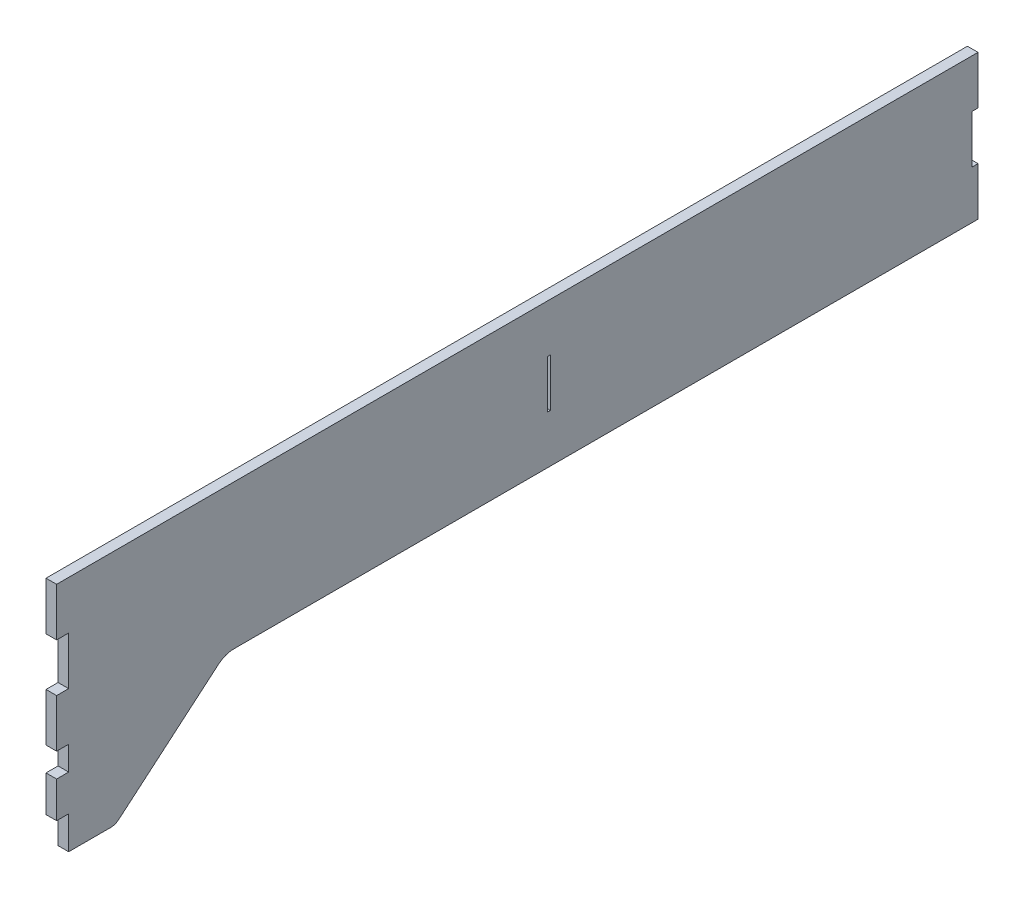
ISO-10303-21;
HEADER;
FILE_DESCRIPTION(('STEP AP214'),'2;1');
FILE_NAME('part.step','',(''),(''),'','','');
FILE_SCHEMA(('AUTOMOTIVE_DESIGN { 1 0 10303 214 1 1 1 1 }'));
ENDSEC;
DATA;
#1=APPLICATION_CONTEXT('core data for automotive mechanical design processes');
#2=APPLICATION_PROTOCOL_DEFINITION('international standard','automotive_design',2000,#1);
#3=PRODUCT_CONTEXT('',#1,'mechanical');
#4=PRODUCT('Part','Part','',(#3));
#5=PRODUCT_RELATED_PRODUCT_CATEGORY('part','',(#4));
#6=PRODUCT_DEFINITION_FORMATION('','',#4);
#7=PRODUCT_DEFINITION_CONTEXT('part definition',#1,'design');
#8=PRODUCT_DEFINITION('design','',#6,#7);
#9=PRODUCT_DEFINITION_SHAPE('','',#8);
#10=(LENGTH_UNIT() NAMED_UNIT(*) SI_UNIT(.MILLI.,.METRE.));
#11=(NAMED_UNIT(*) PLANE_ANGLE_UNIT() SI_UNIT($,.RADIAN.));
#12=(NAMED_UNIT(*) SI_UNIT($,.STERADIAN.) SOLID_ANGLE_UNIT());
#13=UNCERTAINTY_MEASURE_WITH_UNIT(LENGTH_MEASURE(1.E-05),#10,'distance_accuracy_value','');
#14=(GEOMETRIC_REPRESENTATION_CONTEXT(3) GLOBAL_UNCERTAINTY_ASSIGNED_CONTEXT((#13)) GLOBAL_UNIT_ASSIGNED_CONTEXT((#10,
#11,#12)) REPRESENTATION_CONTEXT('',''));
#15=CARTESIAN_POINT('',(0.,0.,0.));
#16=DIRECTION('',(0.,0.,1.));
#17=DIRECTION('',(1.,0.,0.));
#18=AXIS2_PLACEMENT_3D('',#15,#16,#17);
#19=CARTESIAN_POINT('',(-88.9,-8.60422844084499E-13,-196.85));
#20=DIRECTION('',(0.,0.,1.));
#21=DIRECTION('',(0.,-1.,0.));
#22=AXIS2_PLACEMENT_3D('',#19,#20,#21);
#23=PLANE('',#22);
#24=DIRECTION('',(0.,1.,0.));
#25=VECTOR('',#24,1.);
#26=CARTESIAN_POINT('',(-94.488,-8.60422844084499E-13,-196.85));
#27=LINE('',#26,#25);
#28=CARTESIAN_POINT('',(-94.488,-136.525,-196.85));
#29=VERTEX_POINT('',#28);
#30=CARTESIAN_POINT('',(-94.488,-111.125,-196.85));
#31=VERTEX_POINT('',#30);
#32=EDGE_CURVE('E385',#29,#31,#27,.T.);
#33=ORIENTED_EDGE('',*,*,#32,.F.);
#34=DIRECTION('',(-1.,0.,0.));
#35=VECTOR('',#34,1.);
#36=CARTESIAN_POINT('',(-88.9,-136.525,-196.85));
#37=LINE('',#36,#35);
#38=CARTESIAN_POINT('',(-88.9,-136.525,-196.85));
#39=VERTEX_POINT('',#38);
#40=EDGE_CURVE('E11',#39,#29,#37,.T.);
#41=ORIENTED_EDGE('',*,*,#40,.F.);
#42=DIRECTION('',(0.,1.,0.));
#43=VECTOR('',#42,1.);
#44=CARTESIAN_POINT('',(-88.9,-8.60422844084499E-13,-196.85));
#45=LINE('',#44,#43);
#46=CARTESIAN_POINT('',(-88.9,-111.125,-196.85));
#47=VERTEX_POINT('',#46);
#48=EDGE_CURVE('E327',#39,#47,#45,.T.);
#49=ORIENTED_EDGE('',*,*,#48,.T.);
#50=DIRECTION('',(-1.,0.,0.));
#51=VECTOR('',#50,1.);
#52=CARTESIAN_POINT('',(-88.9,-111.125,-196.85));
#53=LINE('',#52,#51);
#54=EDGE_CURVE('E276',#47,#31,#53,.T.);
#55=ORIENTED_EDGE('',*,*,#54,.T.);
#56=EDGE_LOOP('',(#33,#41,#49,#55));
#57=FACE_BOUND('',#56,.T.);
#58=ADVANCED_FACE('F35',(#57),#23,.T.);
#59=CARTESIAN_POINT('',(-88.9,-136.525,0.));
#60=DIRECTION('',(0.,-1.,0.));
#61=DIRECTION('',(0.,0.,-1.));
#62=AXIS2_PLACEMENT_3D('',#59,#60,#61);
#63=PLANE('',#62);
#64=DIRECTION('',(0.,0.,1.));
#65=VECTOR('',#64,1.);
#66=CARTESIAN_POINT('',(-94.488,-136.525,0.));
#67=LINE('',#66,#65);
#68=CARTESIAN_POINT('',(-94.488,-136.525,-203.2));
#69=VERTEX_POINT('',#68);
#70=EDGE_CURVE('E338',#69,#29,#67,.T.);
#71=ORIENTED_EDGE('',*,*,#70,.F.);
#72=DIRECTION('',(-1.,0.,0.));
#73=VECTOR('',#72,1.);
#74=CARTESIAN_POINT('',(-88.9,-136.525,-203.2));
#75=LINE('',#74,#73);
#76=CARTESIAN_POINT('',(-88.9,-136.525,-203.2));
#77=VERTEX_POINT('',#76);
#78=EDGE_CURVE('E45',#77,#69,#75,.T.);
#79=ORIENTED_EDGE('',*,*,#78,.F.);
#80=DIRECTION('',(0.,0.,1.));
#81=VECTOR('',#80,1.);
#82=CARTESIAN_POINT('',(-88.9,-136.525,0.));
#83=LINE('',#82,#81);
#84=EDGE_CURVE('E231',#77,#39,#83,.T.);
#85=ORIENTED_EDGE('',*,*,#84,.T.);
#86=ORIENTED_EDGE('',*,*,#40,.T.);
#87=EDGE_LOOP('',(#71,#79,#85,#86));
#88=FACE_BOUND('',#87,.T.);
#89=ADVANCED_FACE('F470',(#88),#63,.T.);
#90=CARTESIAN_POINT('',(-88.9,0.,-203.2));
#91=DIRECTION('',(0.,0.,-1.));
#92=DIRECTION('',(-1.,0.,0.));
#93=AXIS2_PLACEMENT_3D('',#90,#91,#92);
#94=PLANE('',#93);
#95=DIRECTION('',(0.,-1.,0.));
#96=VECTOR('',#95,1.);
#97=CARTESIAN_POINT('',(-94.488,0.,-203.2));
#98=LINE('',#97,#96);
#99=CARTESIAN_POINT('',(-94.488,-149.225,-203.2));
#100=VERTEX_POINT('',#99);
#101=EDGE_CURVE('E234',#69,#100,#98,.T.);
#102=ORIENTED_EDGE('',*,*,#101,.T.);
#103=DIRECTION('',(-1.,0.,0.));
#104=VECTOR('',#103,1.);
#105=CARTESIAN_POINT('',(-88.9,-149.225,-203.2));
#106=LINE('',#105,#104);
#107=CARTESIAN_POINT('',(-88.9,-149.225,-203.2));
#108=VERTEX_POINT('',#107);
#109=EDGE_CURVE('E221',#108,#100,#106,.T.);
#110=ORIENTED_EDGE('',*,*,#109,.F.);
#111=DIRECTION('',(0.,-1.,0.));
#112=VECTOR('',#111,1.);
#113=CARTESIAN_POINT('',(-88.9,0.,-203.2));
#114=LINE('',#113,#112);
#115=EDGE_CURVE('E226',#77,#108,#114,.T.);
#116=ORIENTED_EDGE('',*,*,#115,.F.);
#117=ORIENTED_EDGE('',*,*,#78,.T.);
#118=EDGE_LOOP('',(#102,#110,#116,#117));
#119=FACE_BOUND('',#118,.T.);
#120=ADVANCED_FACE('F233',(#119),#94,.F.);
#121=CARTESIAN_POINT('',(-88.9,-149.225,0.));
#122=DIRECTION('',(0.,-1.,0.));
#123=DIRECTION('',(0.,0.,-1.));
#124=AXIS2_PLACEMENT_3D('',#121,#122,#123);
#125=PLANE('',#124);
#126=DIRECTION('',(0.,0.,1.));
#127=VECTOR('',#126,1.);
#128=CARTESIAN_POINT('',(-94.488,-149.225,0.));
#129=LINE('',#128,#127);
#130=CARTESIAN_POINT('',(-94.488,-149.225,-196.85));
#131=VERTEX_POINT('',#130);
#132=EDGE_CURVE('E345',#100,#131,#129,.T.);
#133=ORIENTED_EDGE('',*,*,#132,.T.);
#134=DIRECTION('',(-1.,0.,0.));
#135=VECTOR('',#134,1.);
#136=CARTESIAN_POINT('',(-88.9,-149.225,-196.85));
#137=LINE('',#136,#135);
#138=CARTESIAN_POINT('',(-88.9,-149.225,-196.85));
#139=VERTEX_POINT('',#138);
#140=EDGE_CURVE('E222',#139,#131,#137,.T.);
#141=ORIENTED_EDGE('',*,*,#140,.F.);
#142=DIRECTION('',(0.,0.,1.));
#143=VECTOR('',#142,1.);
#144=CARTESIAN_POINT('',(-88.9,-149.225,0.));
#145=LINE('',#144,#143);
#146=EDGE_CURVE('E216',#108,#139,#145,.T.);
#147=ORIENTED_EDGE('',*,*,#146,.F.);
#148=ORIENTED_EDGE('',*,*,#109,.T.);
#149=EDGE_LOOP('',(#133,#141,#147,#148));
#150=FACE_BOUND('',#149,.T.);
#151=ADVANCED_FACE('F219',(#150),#125,.F.);
#152=CARTESIAN_POINT('',(-88.9,0.,-196.85));
#153=DIRECTION('',(0.,0.,1.));
#154=DIRECTION('',(1.,0.,0.));
#155=AXIS2_PLACEMENT_3D('',#152,#153,#154);
#156=PLANE('',#155);
#157=DIRECTION('',(0.,1.,0.));
#158=VECTOR('',#157,1.);
#159=CARTESIAN_POINT('',(-94.488,0.,-196.85));
#160=LINE('',#159,#158);
#161=CARTESIAN_POINT('',(-94.488,-168.275,-196.85));
#162=VERTEX_POINT('',#161);
#163=EDGE_CURVE('E711',#162,#131,#160,.T.);
#164=ORIENTED_EDGE('',*,*,#163,.F.);
#165=DIRECTION('',(-1.,0.,0.));
#166=VECTOR('',#165,1.);
#167=CARTESIAN_POINT('',(-88.9,-168.275,-196.85));
#168=LINE('',#167,#166);
#169=CARTESIAN_POINT('',(-88.9,-168.275,-196.85));
#170=VERTEX_POINT('',#169);
#171=EDGE_CURVE('E237',#170,#162,#168,.T.);
#172=ORIENTED_EDGE('',*,*,#171,.F.);
#173=DIRECTION('',(0.,1.,0.));
#174=VECTOR('',#173,1.);
#175=CARTESIAN_POINT('',(-88.9,0.,-196.85));
#176=LINE('',#175,#174);
#177=EDGE_CURVE('E227',#170,#139,#176,.T.);
#178=ORIENTED_EDGE('',*,*,#177,.T.);
#179=ORIENTED_EDGE('',*,*,#140,.T.);
#180=EDGE_LOOP('',(#164,#172,#178,#179));
#181=FACE_BOUND('',#180,.T.);
#182=ADVANCED_FACE('F536',(#181),#156,.T.);
#183=CARTESIAN_POINT('',(-88.9,-168.275,0.));
#184=DIRECTION('',(0.,1.,0.));
#185=DIRECTION('',(0.,0.,1.));
#186=AXIS2_PLACEMENT_3D('',#183,#184,#185);
#187=PLANE('',#186);
#188=DIRECTION('',(0.,0.,-1.));
#189=VECTOR('',#188,1.);
#190=CARTESIAN_POINT('',(-94.488,-168.275,0.));
#191=LINE('',#190,#189);
#192=CARTESIAN_POINT('',(-94.488,-168.275,-203.2));
#193=VERTEX_POINT('',#192);
#194=EDGE_CURVE('E714',#162,#193,#191,.T.);
#195=ORIENTED_EDGE('',*,*,#194,.T.);
#196=DIRECTION('',(-1.,0.,0.));
#197=VECTOR('',#196,1.);
#198=CARTESIAN_POINT('',(-88.9,-168.275,-203.2));
#199=LINE('',#198,#197);
#200=CARTESIAN_POINT('',(-88.9,-168.275,-203.2));
#201=VERTEX_POINT('',#200);
#202=EDGE_CURVE('E241',#201,#193,#199,.T.);
#203=ORIENTED_EDGE('',*,*,#202,.F.);
#204=DIRECTION('',(0.,0.,-1.));
#205=VECTOR('',#204,1.);
#206=CARTESIAN_POINT('',(-88.9,-168.275,0.));
#207=LINE('',#206,#205);
#208=EDGE_CURVE('E400',#170,#201,#207,.T.);
#209=ORIENTED_EDGE('',*,*,#208,.F.);
#210=ORIENTED_EDGE('',*,*,#171,.T.);
#211=EDGE_LOOP('',(#195,#203,#209,#210));
#212=FACE_BOUND('',#211,.T.);
#213=ADVANCED_FACE('F532',(#212),#187,.F.);
#214=CARTESIAN_POINT('',(-88.9,0.,-203.2));
#215=DIRECTION('',(0.,0.,-1.));
#216=DIRECTION('',(-1.,0.,0.));
#217=AXIS2_PLACEMENT_3D('',#214,#215,#216);
#218=PLANE('',#217);
#219=DIRECTION('',(0.,-1.,0.));
#220=VECTOR('',#219,1.);
#221=CARTESIAN_POINT('',(-94.488,0.,-203.2));
#222=LINE('',#221,#220);
#223=CARTESIAN_POINT('',(-94.488,-185.6232,-203.2));
#224=VERTEX_POINT('',#223);
#225=EDGE_CURVE('E718',#193,#224,#222,.T.);
#226=ORIENTED_EDGE('',*,*,#225,.T.);
#227=DIRECTION('',(-1.,0.,0.));
#228=VECTOR('',#227,1.);
#229=CARTESIAN_POINT('',(-88.9,-185.6232,-203.2));
#230=LINE('',#229,#228);
#231=CARTESIAN_POINT('',(-88.9,-185.6232,-203.2));
#232=VERTEX_POINT('',#231);
#233=EDGE_CURVE('E244',#232,#224,#230,.T.);
#234=ORIENTED_EDGE('',*,*,#233,.F.);
#235=DIRECTION('',(0.,-1.,0.));
#236=VECTOR('',#235,1.);
#237=CARTESIAN_POINT('',(-88.9,0.,-203.2));
#238=LINE('',#237,#236);
#239=EDGE_CURVE('E403',#201,#232,#238,.T.);
#240=ORIENTED_EDGE('',*,*,#239,.F.);
#241=ORIENTED_EDGE('',*,*,#202,.T.);
#242=EDGE_LOOP('',(#226,#234,#240,#241));
#243=FACE_BOUND('',#242,.T.);
#244=ADVANCED_FACE('F528',(#243),#218,.F.);
#245=CARTESIAN_POINT('',(-88.9,-185.6232,0.));
#246=DIRECTION('',(0.,1.,0.));
#247=DIRECTION('',(0.,0.,1.));
#248=AXIS2_PLACEMENT_3D('',#245,#246,#247);
#249=PLANE('',#248);
#250=DIRECTION('',(0.,0.,-1.));
#251=VECTOR('',#250,1.);
#252=CARTESIAN_POINT('',(-94.488,-185.6232,0.));
#253=LINE('',#252,#251);
#254=CARTESIAN_POINT('',(-94.488,-185.6232,-225.468256777908));
#255=VERTEX_POINT('',#254);
#256=EDGE_CURVE('E723',#224,#255,#253,.T.);
#257=ORIENTED_EDGE('',*,*,#256,.T.);
#258=DIRECTION('',(-1.,0.,0.));
#259=VECTOR('',#258,1.);
#260=CARTESIAN_POINT('',(-88.9,-185.6232,-225.468256777908));
#261=LINE('',#260,#259);
#262=CARTESIAN_POINT('',(-88.9,-185.6232,-225.468256777908));
#263=VERTEX_POINT('',#262);
#264=EDGE_CURVE('E247',#263,#255,#261,.T.);
#265=ORIENTED_EDGE('',*,*,#264,.F.);
#266=DIRECTION('',(0.,0.,-1.));
#267=VECTOR('',#266,1.);
#268=CARTESIAN_POINT('',(-88.9,-185.6232,0.));
#269=LINE('',#268,#267);
#270=EDGE_CURVE('E406',#232,#263,#269,.T.);
#271=ORIENTED_EDGE('',*,*,#270,.F.);
#272=ORIENTED_EDGE('',*,*,#233,.T.);
#273=EDGE_LOOP('',(#257,#265,#271,#272));
#274=FACE_BOUND('',#273,.T.);
#275=ADVANCED_FACE('F524',(#274),#249,.F.);
#276=CARTESIAN_POINT('',(-88.9,-179.2732,-225.468256777908));
#277=DIRECTION('',(-1.,0.,0.));
#278=DIRECTION('',(0.,0.,1.));
#279=AXIS2_PLACEMENT_3D('',#276,#277,#278);
#280=CYLINDRICAL_SURFACE('',#279,6.35);
#281=CARTESIAN_POINT('',(-94.488,-179.2732,-225.468256777908));
#282=DIRECTION('',(-1.,0.,0.));
#283=DIRECTION('',(0.,0.,1.));
#284=AXIS2_PLACEMENT_3D('',#281,#282,#283);
#285=CIRCLE('',#284,6.35);
#286=CARTESIAN_POINT('',(-94.488,-184.118202659296,-229.572943030403));
#287=VERTEX_POINT('',#286);
#288=EDGE_CURVE('E726',#287,#255,#285,.T.);
#289=ORIENTED_EDGE('',*,*,#288,.F.);
#290=DIRECTION('',(-1.,0.,0.));
#291=VECTOR('',#290,1.);
#292=CARTESIAN_POINT('',(-88.9,-184.118202659296,-229.572943030403));
#293=LINE('',#292,#291);
#294=CARTESIAN_POINT('',(-88.9,-184.118202659296,-229.572943030403));
#295=VERTEX_POINT('',#294);
#296=EDGE_CURVE('E249',#295,#287,#293,.T.);
#297=ORIENTED_EDGE('',*,*,#296,.F.);
#298=CARTESIAN_POINT('',(-88.9,-179.2732,-225.468256777908));
#299=DIRECTION('',(-1.,0.,0.));
#300=DIRECTION('',(0.,0.,1.));
#301=AXIS2_PLACEMENT_3D('',#298,#299,#300);
#302=CIRCLE('',#301,6.35);
#303=EDGE_CURVE('E408',#295,#263,#302,.T.);
#304=ORIENTED_EDGE('',*,*,#303,.T.);
#305=ORIENTED_EDGE('',*,*,#264,.T.);
#306=EDGE_LOOP('',(#289,#297,#304,#305));
#307=FACE_BOUND('',#306,.T.);
#308=ADVANCED_FACE('F521',(#307),#280,.T.);
#309=CARTESIAN_POINT('',(-88.9,-220.4120949489,-186.73312681973));
#310=DIRECTION('',(0.,0.762992544771004,0.646407283857374));
#311=DIRECTION('',(0.,-0.646407283857374,0.762992544771004));
#312=AXIS2_PLACEMENT_3D('',#309,#310,#311);
#313=PLANE('',#312);
#314=DIRECTION('',(0.,0.646407283857374,-0.762992544771004));
#315=VECTOR('',#314,1.);
#316=CARTESIAN_POINT('',(-94.488,-220.4120949489,-186.73312681973));
#317=LINE('',#316,#315);
#318=CARTESIAN_POINT('',(-94.488,-139.534994681408,-282.197126201904));
#319=VERTEX_POINT('',#318);
#320=EDGE_CURVE('E355',#287,#319,#317,.T.);
#321=ORIENTED_EDGE('',*,*,#320,.T.);
#322=DIRECTION('',(-1.,0.,0.));
#323=VECTOR('',#322,1.);
#324=CARTESIAN_POINT('',(-88.9,-139.534994681408,-282.197126201904));
#325=LINE('',#324,#323);
#326=CARTESIAN_POINT('',(-88.9,-139.534994681408,-282.197126201904));
#327=VERTEX_POINT('',#326);
#328=EDGE_CURVE('E251',#327,#319,#325,.T.);
#329=ORIENTED_EDGE('',*,*,#328,.F.);
#330=DIRECTION('',(0.,0.646407283857374,-0.762992544771004));
#331=VECTOR('',#330,1.);
#332=CARTESIAN_POINT('',(-88.9,-220.4120949489,-186.73312681973));
#333=LINE('',#332,#331);
#334=EDGE_CURVE('E295',#295,#327,#333,.T.);
#335=ORIENTED_EDGE('',*,*,#334,.F.);
#336=ORIENTED_EDGE('',*,*,#296,.T.);
#337=EDGE_LOOP('',(#321,#329,#335,#336));
#338=FACE_BOUND('',#337,.T.);
#339=ADVANCED_FACE('F418',(#338),#313,.F.);
#340=CARTESIAN_POINT('',(-88.9,-149.225,-290.406498706893));
#341=DIRECTION('',(-1.,0.,0.));
#342=DIRECTION('',(0.,0.,1.));
#343=AXIS2_PLACEMENT_3D('',#340,#341,#342);
#344=CYLINDRICAL_SURFACE('',#343,12.7);
#345=CARTESIAN_POINT('',(-94.488,-149.225,-290.406498706893));
#346=DIRECTION('',(-1.,0.,0.));
#347=DIRECTION('',(0.,0.,1.));
#348=AXIS2_PLACEMENT_3D('',#345,#346,#347);
#349=CIRCLE('',#348,12.7);
#350=CARTESIAN_POINT('',(-94.488,-136.525,-290.406498706893));
#351=VERTEX_POINT('',#350);
#352=EDGE_CURVE('E350',#319,#351,#349,.T.);
#353=ORIENTED_EDGE('',*,*,#352,.T.);
#354=DIRECTION('',(-1.,0.,0.));
#355=VECTOR('',#354,1.);
#356=CARTESIAN_POINT('',(-88.9,-136.525,-290.406498706893));
#357=LINE('',#356,#355);
#358=CARTESIAN_POINT('',(-88.9,-136.525,-290.406498706893));
#359=VERTEX_POINT('',#358);
#360=EDGE_CURVE('E254',#359,#351,#357,.T.);
#361=ORIENTED_EDGE('',*,*,#360,.F.);
#362=CARTESIAN_POINT('',(-88.9,-149.225,-290.406498706893));
#363=DIRECTION('',(-1.,0.,0.));
#364=DIRECTION('',(0.,0.,1.));
#365=AXIS2_PLACEMENT_3D('',#362,#363,#364);
#366=CIRCLE('',#365,12.7);
#367=EDGE_CURVE('E291',#327,#359,#366,.T.);
#368=ORIENTED_EDGE('',*,*,#367,.F.);
#369=ORIENTED_EDGE('',*,*,#328,.T.);
#370=EDGE_LOOP('',(#353,#361,#368,#369));
#371=FACE_BOUND('',#370,.T.);
#372=ADVANCED_FACE('F421',(#371),#344,.F.);
#373=CARTESIAN_POINT('',(-94.488,-136.525,-682.625));
#374=VERTEX_POINT('',#373);
#375=EDGE_CURVE('E342',#374,#351,#67,.T.);
#376=ORIENTED_EDGE('',*,*,#375,.F.);
#377=DIRECTION('',(-1.,0.,0.));
#378=VECTOR('',#377,1.);
#379=CARTESIAN_POINT('',(-88.9,-136.525,-682.625));
#380=LINE('',#379,#378);
#381=CARTESIAN_POINT('',(-88.9,-136.525,-682.625));
#382=VERTEX_POINT('',#381);
#383=EDGE_CURVE('E256',#382,#374,#380,.T.);
#384=ORIENTED_EDGE('',*,*,#383,.F.);
#385=EDGE_CURVE('E287',#382,#359,#83,.T.);
#386=ORIENTED_EDGE('',*,*,#385,.T.);
#387=ORIENTED_EDGE('',*,*,#360,.T.);
#388=EDGE_LOOP('',(#376,#384,#386,#387));
#389=FACE_BOUND('',#388,.T.);
#390=ADVANCED_FACE('F422',(#389),#63,.T.);
#391=CARTESIAN_POINT('',(-88.9,0.,-682.625));
#392=DIRECTION('',(0.,0.,-1.));
#393=DIRECTION('',(-1.,0.,0.));
#394=AXIS2_PLACEMENT_3D('',#391,#392,#393);
#395=PLANE('',#394);
#396=DIRECTION('',(0.,-1.,0.));
#397=VECTOR('',#396,1.);
#398=CARTESIAN_POINT('',(-94.488,0.,-682.625));
#399=LINE('',#398,#397);
#400=CARTESIAN_POINT('',(-94.488,-111.125,-682.625));
#401=VERTEX_POINT('',#400);
#402=EDGE_CURVE('E351',#401,#374,#399,.T.);
#403=ORIENTED_EDGE('',*,*,#402,.F.);
#404=DIRECTION('',(-1.,0.,0.));
#405=VECTOR('',#404,1.);
#406=CARTESIAN_POINT('',(-88.9,-111.125,-682.625));
#407=LINE('',#406,#405);
#408=CARTESIAN_POINT('',(-88.9,-111.125,-682.625));
#409=VERTEX_POINT('',#408);
#410=EDGE_CURVE('E258',#409,#401,#407,.T.);
#411=ORIENTED_EDGE('',*,*,#410,.F.);
#412=DIRECTION('',(0.,-1.,0.));
#413=VECTOR('',#412,1.);
#414=CARTESIAN_POINT('',(-88.9,0.,-682.625));
#415=LINE('',#414,#413);
#416=EDGE_CURVE('E292',#409,#382,#415,.T.);
#417=ORIENTED_EDGE('',*,*,#416,.T.);
#418=ORIENTED_EDGE('',*,*,#383,.T.);
#419=EDGE_LOOP('',(#403,#411,#417,#418));
#420=FACE_BOUND('',#419,.T.);
#421=ADVANCED_FACE('F514',(#420),#395,.T.);
#422=CARTESIAN_POINT('',(-88.9,-111.125,0.));
#423=DIRECTION('',(0.,1.,0.));
#424=DIRECTION('',(0.,0.,1.));
#425=AXIS2_PLACEMENT_3D('',#422,#423,#424);
#426=PLANE('',#425);
#427=DIRECTION('',(0.,0.,-1.));
#428=VECTOR('',#427,1.);
#429=CARTESIAN_POINT('',(-94.488,-111.125,0.));
#430=LINE('',#429,#428);
#431=CARTESIAN_POINT('',(-94.488,-111.125,-679.45));
#432=VERTEX_POINT('',#431);
#433=EDGE_CURVE('E356',#432,#401,#430,.T.);
#434=ORIENTED_EDGE('',*,*,#433,.F.);
#435=DIRECTION('',(-1.,0.,0.));
#436=VECTOR('',#435,1.);
#437=CARTESIAN_POINT('',(-88.9,-111.125,-679.45));
#438=LINE('',#437,#436);
#439=CARTESIAN_POINT('',(-88.9,-111.125,-679.45));
#440=VERTEX_POINT('',#439);
#441=EDGE_CURVE('E260',#440,#432,#438,.T.);
#442=ORIENTED_EDGE('',*,*,#441,.F.);
#443=DIRECTION('',(0.,0.,-1.));
#444=VECTOR('',#443,1.);
#445=CARTESIAN_POINT('',(-88.9,-111.125,0.));
#446=LINE('',#445,#444);
#447=EDGE_CURVE('E297',#440,#409,#446,.T.);
#448=ORIENTED_EDGE('',*,*,#447,.T.);
#449=ORIENTED_EDGE('',*,*,#410,.T.);
#450=EDGE_LOOP('',(#434,#442,#448,#449));
#451=FACE_BOUND('',#450,.T.);
#452=ADVANCED_FACE('F427',(#451),#426,.T.);
#453=CARTESIAN_POINT('',(-88.9,0.,-679.45));
#454=DIRECTION('',(0.,0.,-1.));
#455=DIRECTION('',(-1.,0.,0.));
#456=AXIS2_PLACEMENT_3D('',#453,#454,#455);
#457=PLANE('',#456);
#458=DIRECTION('',(0.,-1.,0.));
#459=VECTOR('',#458,1.);
#460=CARTESIAN_POINT('',(-94.488,0.,-679.45));
#461=LINE('',#460,#459);
#462=CARTESIAN_POINT('',(-94.488,-85.7250000000001,-679.45));
#463=VERTEX_POINT('',#462);
#464=EDGE_CURVE('E359',#463,#432,#461,.T.);
#465=ORIENTED_EDGE('',*,*,#464,.F.);
#466=DIRECTION('',(-1.,0.,0.));
#467=VECTOR('',#466,1.);
#468=CARTESIAN_POINT('',(-88.9,-85.7250000000001,-679.45));
#469=LINE('',#468,#467);
#470=CARTESIAN_POINT('',(-88.9,-85.7250000000001,-679.45));
#471=VERTEX_POINT('',#470);
#472=EDGE_CURVE('E262',#471,#463,#469,.T.);
#473=ORIENTED_EDGE('',*,*,#472,.F.);
#474=DIRECTION('',(0.,-1.,0.));
#475=VECTOR('',#474,1.);
#476=CARTESIAN_POINT('',(-88.9,0.,-679.45));
#477=LINE('',#476,#475);
#478=EDGE_CURVE('E301',#471,#440,#477,.T.);
#479=ORIENTED_EDGE('',*,*,#478,.T.);
#480=ORIENTED_EDGE('',*,*,#441,.T.);
#481=EDGE_LOOP('',(#465,#473,#479,#480));
#482=FACE_BOUND('',#481,.T.);
#483=ADVANCED_FACE('F430',(#482),#457,.T.);
#484=CARTESIAN_POINT('',(-88.9,-85.7250000000001,0.));
#485=DIRECTION('',(0.,-1.,0.));
#486=DIRECTION('',(0.,0.,-1.));
#487=AXIS2_PLACEMENT_3D('',#484,#485,#486);
#488=PLANE('',#487);
#489=DIRECTION('',(0.,0.,1.));
#490=VECTOR('',#489,1.);
#491=CARTESIAN_POINT('',(-94.488,-85.7250000000001,0.));
#492=LINE('',#491,#490);
#493=CARTESIAN_POINT('',(-94.488,-85.7250000000001,-682.625));
#494=VERTEX_POINT('',#493);
#495=EDGE_CURVE('E364',#494,#463,#492,.T.);
#496=ORIENTED_EDGE('',*,*,#495,.F.);
#497=DIRECTION('',(-1.,0.,0.));
#498=VECTOR('',#497,1.);
#499=CARTESIAN_POINT('',(-88.9,-85.7250000000001,-682.625));
#500=LINE('',#499,#498);
#501=CARTESIAN_POINT('',(-88.9,-85.7250000000001,-682.625));
#502=VERTEX_POINT('',#501);
#503=EDGE_CURVE('E264',#502,#494,#500,.T.);
#504=ORIENTED_EDGE('',*,*,#503,.F.);
#505=DIRECTION('',(0.,0.,1.));
#506=VECTOR('',#505,1.);
#507=CARTESIAN_POINT('',(-88.9,-85.7250000000001,0.));
#508=LINE('',#507,#506);
#509=EDGE_CURVE('E306',#502,#471,#508,.T.);
#510=ORIENTED_EDGE('',*,*,#509,.T.);
#511=ORIENTED_EDGE('',*,*,#472,.T.);
#512=EDGE_LOOP('',(#496,#504,#510,#511));
#513=FACE_BOUND('',#512,.T.);
#514=ADVANCED_FACE('F435',(#513),#488,.T.);
#515=CARTESIAN_POINT('',(-88.9,0.,-682.625));
#516=DIRECTION('',(0.,0.,-1.));
#517=DIRECTION('',(-1.,0.,0.));
#518=AXIS2_PLACEMENT_3D('',#515,#516,#517);
#519=PLANE('',#518);
#520=DIRECTION('',(0.,-1.,0.));
#521=VECTOR('',#520,1.);
#522=CARTESIAN_POINT('',(-94.488,0.,-682.625));
#523=LINE('',#522,#521);
#524=CARTESIAN_POINT('',(-94.488,-60.3250000000001,-682.625));
#525=VERTEX_POINT('',#524);
#526=EDGE_CURVE('E367',#525,#494,#523,.T.);
#527=ORIENTED_EDGE('',*,*,#526,.F.);
#528=DIRECTION('',(-1.,0.,0.));
#529=VECTOR('',#528,1.);
#530=CARTESIAN_POINT('',(-88.9,-60.3250000000001,-682.625));
#531=LINE('',#530,#529);
#532=CARTESIAN_POINT('',(-88.9,-60.3250000000001,-682.625));
#533=VERTEX_POINT('',#532);
#534=EDGE_CURVE('E266',#533,#525,#531,.T.);
#535=ORIENTED_EDGE('',*,*,#534,.F.);
#536=DIRECTION('',(0.,-1.,0.));
#537=VECTOR('',#536,1.);
#538=CARTESIAN_POINT('',(-88.9,0.,-682.625));
#539=LINE('',#538,#537);
#540=EDGE_CURVE('E309',#533,#502,#539,.T.);
#541=ORIENTED_EDGE('',*,*,#540,.T.);
#542=ORIENTED_EDGE('',*,*,#503,.T.);
#543=EDGE_LOOP('',(#527,#535,#541,#542));
#544=FACE_BOUND('',#543,.T.);
#545=ADVANCED_FACE('F438',(#544),#519,.T.);
#546=CARTESIAN_POINT('',(-88.9,-60.325,0.));
#547=DIRECTION('',(0.,1.,0.));
#548=DIRECTION('',(0.,0.,1.));
#549=AXIS2_PLACEMENT_3D('',#546,#547,#548);
#550=PLANE('',#549);
#551=DIRECTION('',(0.,0.,-1.));
#552=VECTOR('',#551,1.);
#553=CARTESIAN_POINT('',(-94.488,-60.325,0.));
#554=LINE('',#553,#552);
#555=CARTESIAN_POINT('',(-94.488,-60.325,-196.85));
#556=VERTEX_POINT('',#555);
#557=EDGE_CURVE('E370',#556,#525,#554,.T.);
#558=ORIENTED_EDGE('',*,*,#557,.F.);
#559=DIRECTION('',(-1.,0.,0.));
#560=VECTOR('',#559,1.);
#561=CARTESIAN_POINT('',(-88.9,-60.325,-196.85));
#562=LINE('',#561,#560);
#563=CARTESIAN_POINT('',(-88.9,-60.325,-196.85));
#564=VERTEX_POINT('',#563);
#565=EDGE_CURVE('E268',#564,#556,#562,.T.);
#566=ORIENTED_EDGE('',*,*,#565,.F.);
#567=DIRECTION('',(0.,0.,-1.));
#568=VECTOR('',#567,1.);
#569=CARTESIAN_POINT('',(-88.9,-60.325,0.));
#570=LINE('',#569,#568);
#571=EDGE_CURVE('E312',#564,#533,#570,.T.);
#572=ORIENTED_EDGE('',*,*,#571,.T.);
#573=ORIENTED_EDGE('',*,*,#534,.T.);
#574=EDGE_LOOP('',(#558,#566,#572,#573));
#575=FACE_BOUND('',#574,.T.);
#576=ADVANCED_FACE('F443',(#575),#550,.T.);
#577=CARTESIAN_POINT('',(-88.9,8.60422844084493E-13,-196.85));
#578=DIRECTION('',(0.,0.,1.));
#579=DIRECTION('',(0.,-1.,0.));
#580=AXIS2_PLACEMENT_3D('',#577,#578,#579);
#581=PLANE('',#580);
#582=DIRECTION('',(0.,1.,0.));
#583=VECTOR('',#582,1.);
#584=CARTESIAN_POINT('',(-94.488,8.60422844084493E-13,-196.85));
#585=LINE('',#584,#583);
#586=CARTESIAN_POINT('',(-94.488,-85.7250000000001,-196.85));
#587=VERTEX_POINT('',#586);
#588=EDGE_CURVE('E373',#587,#556,#585,.T.);
#589=ORIENTED_EDGE('',*,*,#588,.F.);
#590=DIRECTION('',(-1.,0.,0.));
#591=VECTOR('',#590,1.);
#592=CARTESIAN_POINT('',(-88.9,-85.7250000000001,-196.85));
#593=LINE('',#592,#591);
#594=CARTESIAN_POINT('',(-88.9,-85.7250000000001,-196.85));
#595=VERTEX_POINT('',#594);
#596=EDGE_CURVE('E270',#595,#587,#593,.T.);
#597=ORIENTED_EDGE('',*,*,#596,.F.);
#598=DIRECTION('',(0.,1.,0.));
#599=VECTOR('',#598,1.);
#600=CARTESIAN_POINT('',(-88.9,8.60422844084493E-13,-196.85));
#601=LINE('',#600,#599);
#602=EDGE_CURVE('E315',#595,#564,#601,.T.);
#603=ORIENTED_EDGE('',*,*,#602,.T.);
#604=ORIENTED_EDGE('',*,*,#565,.T.);
#605=EDGE_LOOP('',(#589,#597,#603,#604));
#606=FACE_BOUND('',#605,.T.);
#607=ADVANCED_FACE('F446',(#606),#581,.T.);
#608=CARTESIAN_POINT('',(-88.9,-85.7249999999983,7.4940054162198E-13));
#609=DIRECTION('',(0.,-1.,0.));
#610=DIRECTION('',(0.,0.,-1.));
#611=AXIS2_PLACEMENT_3D('',#608,#609,#610);
#612=PLANE('',#611);
#613=DIRECTION('',(0.,0.,1.));
#614=VECTOR('',#613,1.);
#615=CARTESIAN_POINT('',(-94.488,-85.7249999999983,7.4940054162198E-13));
#616=LINE('',#615,#614);
#617=CARTESIAN_POINT('',(-94.488,-85.7250000000001,-203.2));
#618=VERTEX_POINT('',#617);
#619=EDGE_CURVE('E376',#618,#587,#616,.T.);
#620=ORIENTED_EDGE('',*,*,#619,.F.);
#621=DIRECTION('',(-1.,0.,0.));
#622=VECTOR('',#621,1.);
#623=CARTESIAN_POINT('',(-88.9,-85.7250000000001,-203.2));
#624=LINE('',#623,#622);
#625=CARTESIAN_POINT('',(-88.9,-85.7250000000001,-203.2));
#626=VERTEX_POINT('',#625);
#627=EDGE_CURVE('E272',#626,#618,#624,.T.);
#628=ORIENTED_EDGE('',*,*,#627,.F.);
#629=DIRECTION('',(0.,0.,1.));
#630=VECTOR('',#629,1.);
#631=CARTESIAN_POINT('',(-88.9,-85.7249999999983,7.4940054162198E-13));
#632=LINE('',#631,#630);
#633=EDGE_CURVE('E318',#626,#595,#632,.T.);
#634=ORIENTED_EDGE('',*,*,#633,.T.);
#635=ORIENTED_EDGE('',*,*,#596,.T.);
#636=EDGE_LOOP('',(#620,#628,#634,#635));
#637=FACE_BOUND('',#636,.T.);
#638=ADVANCED_FACE('F451',(#637),#612,.T.);
#639=CARTESIAN_POINT('',(-88.9,0.,-203.2));
#640=DIRECTION('',(0.,0.,1.));
#641=DIRECTION('',(1.,0.,0.));
#642=AXIS2_PLACEMENT_3D('',#639,#640,#641);
#643=PLANE('',#642);
#644=DIRECTION('',(0.,1.,0.));
#645=VECTOR('',#644,1.);
#646=CARTESIAN_POINT('',(-94.488,0.,-203.2));
#647=LINE('',#646,#645);
#648=CARTESIAN_POINT('',(-94.488,-111.125,-203.2));
#649=VERTEX_POINT('',#648);
#650=EDGE_CURVE('E379',#649,#618,#647,.T.);
#651=ORIENTED_EDGE('',*,*,#650,.F.);
#652=DIRECTION('',(-1.,0.,0.));
#653=VECTOR('',#652,1.);
#654=CARTESIAN_POINT('',(-88.9,-111.125,-203.2));
#655=LINE('',#654,#653);
#656=CARTESIAN_POINT('',(-88.9,-111.125,-203.2));
#657=VERTEX_POINT('',#656);
#658=EDGE_CURVE('E274',#657,#649,#655,.T.);
#659=ORIENTED_EDGE('',*,*,#658,.F.);
#660=DIRECTION('',(0.,1.,0.));
#661=VECTOR('',#660,1.);
#662=CARTESIAN_POINT('',(-88.9,0.,-203.2));
#663=LINE('',#662,#661);
#664=EDGE_CURVE('E321',#657,#626,#663,.T.);
#665=ORIENTED_EDGE('',*,*,#664,.T.);
#666=ORIENTED_EDGE('',*,*,#627,.T.);
#667=EDGE_LOOP('',(#651,#659,#665,#666));
#668=FACE_BOUND('',#667,.T.);
#669=ADVANCED_FACE('F454',(#668),#643,.T.);
#670=CARTESIAN_POINT('',(-88.9,0.,-455.6125));
#671=DIRECTION('',(0.,0.,-1.));
#672=DIRECTION('',(-1.,0.,0.));
#673=AXIS2_PLACEMENT_3D('',#670,#671,#672);
#674=PLANE('',#673);
#675=DIRECTION('',(0.,-1.,0.));
#676=VECTOR('',#675,1.);
#677=CARTESIAN_POINT('',(-94.488,0.,-455.6125));
#678=LINE('',#677,#676);
#679=CARTESIAN_POINT('',(-94.488,-85.7250000000001,-455.6125));
#680=VERTEX_POINT('',#679);
#681=CARTESIAN_POINT('',(-94.488,-111.125,-455.6125));
#682=VERTEX_POINT('',#681);
#683=EDGE_CURVE('E396',#680,#682,#678,.T.);
#684=ORIENTED_EDGE('',*,*,#683,.F.);
#685=DIRECTION('',(-1.,0.,0.));
#686=VECTOR('',#685,1.);
#687=CARTESIAN_POINT('',(-88.9,-85.7250000000001,-455.6125));
#688=LINE('',#687,#686);
#689=CARTESIAN_POINT('',(-88.9,-85.7250000000001,-455.6125));
#690=VERTEX_POINT('',#689);
#691=EDGE_CURVE('E278',#690,#680,#688,.T.);
#692=ORIENTED_EDGE('',*,*,#691,.F.);
#693=DIRECTION('',(0.,-1.,0.));
#694=VECTOR('',#693,1.);
#695=CARTESIAN_POINT('',(-88.9,0.,-455.6125));
#696=LINE('',#695,#694);
#697=CARTESIAN_POINT('',(-88.9,-111.125,-455.6125));
#698=VERTEX_POINT('',#697);
#699=EDGE_CURVE('E337',#690,#698,#696,.T.);
#700=ORIENTED_EDGE('',*,*,#699,.T.);
#701=DIRECTION('',(-1.,0.,0.));
#702=VECTOR('',#701,1.);
#703=CARTESIAN_POINT('',(-88.9,-111.125,-455.6125));
#704=LINE('',#703,#702);
#705=EDGE_CURVE('E39',#698,#682,#704,.T.);
#706=ORIENTED_EDGE('',*,*,#705,.T.);
#707=EDGE_LOOP('',(#684,#692,#700,#706));
#708=FACE_BOUND('',#707,.T.);
#709=ADVANCED_FACE('F37',(#708),#674,.T.);
#710=CARTESIAN_POINT('',(-88.9,-85.7250000000001,0.));
#711=DIRECTION('',(0.,-1.,0.));
#712=DIRECTION('',(0.,0.,-1.));
#713=AXIS2_PLACEMENT_3D('',#710,#711,#712);
#714=PLANE('',#713);
#715=DIRECTION('',(0.,0.,1.));
#716=VECTOR('',#715,1.);
#717=CARTESIAN_POINT('',(-94.488,-85.7250000000001,0.));
#718=LINE('',#717,#716);
#719=CARTESIAN_POINT('',(-94.488,-85.7250000000001,-457.2));
#720=VERTEX_POINT('',#719);
#721=EDGE_CURVE('E387',#720,#680,#718,.T.);
#722=ORIENTED_EDGE('',*,*,#721,.F.);
#723=DIRECTION('',(-1.,0.,0.));
#724=VECTOR('',#723,1.);
#725=CARTESIAN_POINT('',(-88.9,-85.7250000000001,-457.2));
#726=LINE('',#725,#724);
#727=CARTESIAN_POINT('',(-88.9,-85.7250000000001,-457.2));
#728=VERTEX_POINT('',#727);
#729=EDGE_CURVE('E280',#728,#720,#726,.T.);
#730=ORIENTED_EDGE('',*,*,#729,.F.);
#731=DIRECTION('',(0.,0.,1.));
#732=VECTOR('',#731,1.);
#733=CARTESIAN_POINT('',(-88.9,-85.7250000000001,0.));
#734=LINE('',#733,#732);
#735=EDGE_CURVE('E329',#728,#690,#734,.T.);
#736=ORIENTED_EDGE('',*,*,#735,.T.);
#737=ORIENTED_EDGE('',*,*,#691,.T.);
#738=EDGE_LOOP('',(#722,#730,#736,#737));
#739=FACE_BOUND('',#738,.T.);
#740=ADVANCED_FACE('F478',(#739),#714,.T.);
#741=CARTESIAN_POINT('',(-88.9,0.,-457.2));
#742=DIRECTION('',(0.,0.,1.));
#743=DIRECTION('',(1.,0.,0.));
#744=AXIS2_PLACEMENT_3D('',#741,#742,#743);
#745=PLANE('',#744);
#746=DIRECTION('',(0.,1.,0.));
#747=VECTOR('',#746,1.);
#748=CARTESIAN_POINT('',(-94.488,0.,-457.2));
#749=LINE('',#748,#747);
#750=CARTESIAN_POINT('',(-94.488,-111.125,-457.2));
#751=VERTEX_POINT('',#750);
#752=EDGE_CURVE('E390',#751,#720,#749,.T.);
#753=ORIENTED_EDGE('',*,*,#752,.F.);
#754=DIRECTION('',(-1.,0.,0.));
#755=VECTOR('',#754,1.);
#756=CARTESIAN_POINT('',(-88.9,-111.125,-457.2));
#757=LINE('',#756,#755);
#758=CARTESIAN_POINT('',(-88.9,-111.125,-457.2));
#759=VERTEX_POINT('',#758);
#760=EDGE_CURVE('E281',#759,#751,#757,.T.);
#761=ORIENTED_EDGE('',*,*,#760,.F.);
#762=DIRECTION('',(0.,1.,0.));
#763=VECTOR('',#762,1.);
#764=CARTESIAN_POINT('',(-88.9,0.,-457.2));
#765=LINE('',#764,#763);
#766=EDGE_CURVE('E332',#759,#728,#765,.T.);
#767=ORIENTED_EDGE('',*,*,#766,.T.);
#768=ORIENTED_EDGE('',*,*,#729,.T.);
#769=EDGE_LOOP('',(#753,#761,#767,#768));
#770=FACE_BOUND('',#769,.T.);
#771=ADVANCED_FACE('F481',(#770),#745,.T.);
#772=CARTESIAN_POINT('',(-88.9,-111.125,0.));
#773=DIRECTION('',(0.,1.,0.));
#774=DIRECTION('',(0.,0.,1.));
#775=AXIS2_PLACEMENT_3D('',#772,#773,#774);
#776=PLANE('',#775);
#777=DIRECTION('',(0.,0.,-1.));
#778=VECTOR('',#777,1.);
#779=CARTESIAN_POINT('',(-94.488,-111.125,0.));
#780=LINE('',#779,#778);
#781=EDGE_CURVE('E393',#682,#751,#780,.T.);
#782=ORIENTED_EDGE('',*,*,#781,.F.);
#783=ORIENTED_EDGE('',*,*,#705,.F.);
#784=DIRECTION('',(0.,0.,-1.));
#785=VECTOR('',#784,1.);
#786=CARTESIAN_POINT('',(-88.9,-111.125,0.));
#787=LINE('',#786,#785);
#788=EDGE_CURVE('E335',#698,#759,#787,.T.);
#789=ORIENTED_EDGE('',*,*,#788,.T.);
#790=ORIENTED_EDGE('',*,*,#760,.T.);
#791=EDGE_LOOP('',(#782,#783,#789,#790));
#792=FACE_BOUND('',#791,.T.);
#793=ADVANCED_FACE('F484',(#792),#776,.T.);
#794=CARTESIAN_POINT('',(-88.9,-111.124999999999,4.85722573273509E-13));
#795=DIRECTION('',(0.,1.,0.));
#796=DIRECTION('',(0.,0.,1.));
#797=AXIS2_PLACEMENT_3D('',#794,#795,#796);
#798=PLANE('',#797);
#799=DIRECTION('',(0.,0.,-1.));
#800=VECTOR('',#799,1.);
#801=CARTESIAN_POINT('',(-94.488,-111.124999999999,4.85722573273509E-13));
#802=LINE('',#801,#800);
#803=EDGE_CURVE('E382',#31,#649,#802,.T.);
#804=ORIENTED_EDGE('',*,*,#803,.F.);
#805=ORIENTED_EDGE('',*,*,#54,.F.);
#806=DIRECTION('',(0.,0.,-1.));
#807=VECTOR('',#806,1.);
#808=CARTESIAN_POINT('',(-88.9,-111.124999999999,4.85722573273509E-13));
#809=LINE('',#808,#807);
#810=EDGE_CURVE('E324',#47,#657,#809,.T.);
#811=ORIENTED_EDGE('',*,*,#810,.T.);
#812=ORIENTED_EDGE('',*,*,#658,.T.);
#813=EDGE_LOOP('',(#804,#805,#811,#812));
#814=FACE_BOUND('',#813,.T.);
#815=ADVANCED_FACE('F458',(#814),#798,.T.);
#816=CARTESIAN_POINT('',(-88.9,0.,0.));
#817=DIRECTION('',(-1.,0.,0.));
#818=DIRECTION('',(0.,0.,1.));
#819=AXIS2_PLACEMENT_3D('',#816,#817,#818);
#820=PLANE('',#819);
#821=ORIENTED_EDGE('',*,*,#699,.F.);
#822=ORIENTED_EDGE('',*,*,#735,.F.);
#823=ORIENTED_EDGE('',*,*,#766,.F.);
#824=ORIENTED_EDGE('',*,*,#788,.F.);
#825=EDGE_LOOP('',(#821,#822,#823,#824));
#826=FACE_BOUND('',#825,.T.);
#827=ORIENTED_EDGE('',*,*,#48,.F.);
#828=ORIENTED_EDGE('',*,*,#84,.F.);
#829=ORIENTED_EDGE('',*,*,#115,.T.);
#830=ORIENTED_EDGE('',*,*,#146,.T.);
#831=ORIENTED_EDGE('',*,*,#177,.F.);
#832=ORIENTED_EDGE('',*,*,#208,.T.);
#833=ORIENTED_EDGE('',*,*,#239,.T.);
#834=ORIENTED_EDGE('',*,*,#270,.T.);
#835=ORIENTED_EDGE('',*,*,#303,.F.);
#836=ORIENTED_EDGE('',*,*,#334,.T.);
#837=ORIENTED_EDGE('',*,*,#367,.T.);
#838=ORIENTED_EDGE('',*,*,#385,.F.);
#839=ORIENTED_EDGE('',*,*,#416,.F.);
#840=ORIENTED_EDGE('',*,*,#447,.F.);
#841=ORIENTED_EDGE('',*,*,#478,.F.);
#842=ORIENTED_EDGE('',*,*,#509,.F.);
#843=ORIENTED_EDGE('',*,*,#540,.F.);
#844=ORIENTED_EDGE('',*,*,#571,.F.);
#845=ORIENTED_EDGE('',*,*,#602,.F.);
#846=ORIENTED_EDGE('',*,*,#633,.F.);
#847=ORIENTED_EDGE('',*,*,#664,.F.);
#848=ORIENTED_EDGE('',*,*,#810,.F.);
#849=EDGE_LOOP('',(#827,#828,#829,#830,#831,#832,#833,#834,#835,#836,#837,#838,#839,#840,#841,
#842,#843,#844,#845,#846,#847,#848));
#850=FACE_BOUND('',#849,.T.);
#851=ADVANCED_FACE('F230',(#826,#850),#820,.F.);
#852=CARTESIAN_POINT('',(-94.488,0.,0.));
#853=DIRECTION('',(-1.,0.,0.));
#854=DIRECTION('',(0.,0.,1.));
#855=AXIS2_PLACEMENT_3D('',#852,#853,#854);
#856=PLANE('',#855);
#857=ORIENTED_EDGE('',*,*,#683,.T.);
#858=ORIENTED_EDGE('',*,*,#781,.T.);
#859=ORIENTED_EDGE('',*,*,#752,.T.);
#860=ORIENTED_EDGE('',*,*,#721,.T.);
#861=EDGE_LOOP('',(#857,#858,#859,#860));
#862=FACE_BOUND('',#861,.T.);
#863=ORIENTED_EDGE('',*,*,#32,.T.);
#864=ORIENTED_EDGE('',*,*,#803,.T.);
#865=ORIENTED_EDGE('',*,*,#650,.T.);
#866=ORIENTED_EDGE('',*,*,#619,.T.);
#867=ORIENTED_EDGE('',*,*,#588,.T.);
#868=ORIENTED_EDGE('',*,*,#557,.T.);
#869=ORIENTED_EDGE('',*,*,#526,.T.);
#870=ORIENTED_EDGE('',*,*,#495,.T.);
#871=ORIENTED_EDGE('',*,*,#464,.T.);
#872=ORIENTED_EDGE('',*,*,#433,.T.);
#873=ORIENTED_EDGE('',*,*,#402,.T.);
#874=ORIENTED_EDGE('',*,*,#375,.T.);
#875=ORIENTED_EDGE('',*,*,#352,.F.);
#876=ORIENTED_EDGE('',*,*,#320,.F.);
#877=ORIENTED_EDGE('',*,*,#288,.T.);
#878=ORIENTED_EDGE('',*,*,#256,.F.);
#879=ORIENTED_EDGE('',*,*,#225,.F.);
#880=ORIENTED_EDGE('',*,*,#194,.F.);
#881=ORIENTED_EDGE('',*,*,#163,.T.);
#882=ORIENTED_EDGE('',*,*,#132,.F.);
#883=ORIENTED_EDGE('',*,*,#101,.F.);
#884=ORIENTED_EDGE('',*,*,#70,.T.);
#885=EDGE_LOOP('',(#863,#864,#865,#866,#867,#868,#869,#870,#871,#872,#873,#874,#875,#876,#877,
#878,#879,#880,#881,#882,#883,#884));
#886=FACE_BOUND('',#885,.T.);
#887=ADVANCED_FACE('F459',(#862,#886),#856,.T.);
#888=CLOSED_SHELL('',(#58,#89,#120,#151,#182,#213,#244,#275,#308,#339,#372,#390,#421,#452,#483,
#514,#545,#576,#607,#638,#669,#709,#740,#771,#793,#815,#851,#887));
#889=MANIFOLD_SOLID_BREP('B2',#888);
#890=ADVANCED_BREP_SHAPE_REPRESENTATION('',(#18,#889),#14);
#891=SHAPE_DEFINITION_REPRESENTATION(#9,#890);
ENDSEC;
END-ISO-10303-21;
